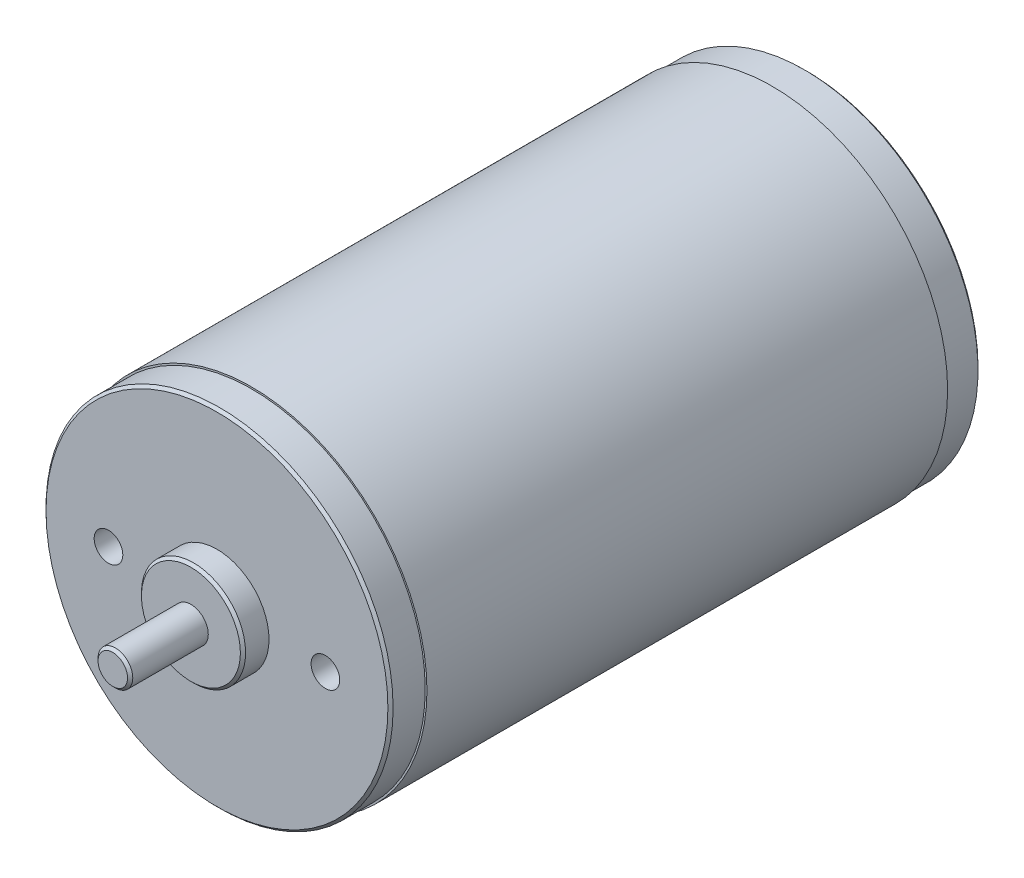
ISO-10303-21;
HEADER;
FILE_DESCRIPTION(('STEP AP214'),'2;1');
FILE_NAME('part.step','',(''),(''),'','','');
FILE_SCHEMA(('AUTOMOTIVE_DESIGN { 1 0 10303 214 1 1 1 1 }'));
ENDSEC;
DATA;
#1=APPLICATION_CONTEXT('core data for automotive mechanical design processes');
#2=APPLICATION_PROTOCOL_DEFINITION('international standard','automotive_design',2000,#1);
#3=PRODUCT_CONTEXT('',#1,'mechanical');
#4=PRODUCT('Part','Part','',(#3));
#5=PRODUCT_RELATED_PRODUCT_CATEGORY('part','',(#4));
#6=PRODUCT_DEFINITION_FORMATION('','',#4);
#7=PRODUCT_DEFINITION_CONTEXT('part definition',#1,'design');
#8=PRODUCT_DEFINITION('design','',#6,#7);
#9=PRODUCT_DEFINITION_SHAPE('','',#8);
#10=(LENGTH_UNIT() NAMED_UNIT(*) SI_UNIT(.MILLI.,.METRE.));
#11=(NAMED_UNIT(*) PLANE_ANGLE_UNIT() SI_UNIT($,.RADIAN.));
#12=(NAMED_UNIT(*) SI_UNIT($,.STERADIAN.) SOLID_ANGLE_UNIT());
#13=UNCERTAINTY_MEASURE_WITH_UNIT(LENGTH_MEASURE(1.E-05),#10,'distance_accuracy_value','');
#14=(GEOMETRIC_REPRESENTATION_CONTEXT(3) GLOBAL_UNCERTAINTY_ASSIGNED_CONTEXT((#13)) GLOBAL_UNIT_ASSIGNED_CONTEXT((#10,
#11,#12)) REPRESENTATION_CONTEXT('',''));
#15=CARTESIAN_POINT('',(0.,0.,0.));
#16=DIRECTION('',(0.,0.,1.));
#17=DIRECTION('',(1.,0.,0.));
#18=AXIS2_PLACEMENT_3D('',#15,#16,#17);
#19=CARTESIAN_POINT('',(0.,0.,-68.));
#20=DIRECTION('',(0.,0.,-1.));
#21=DIRECTION('',(-1.,0.,0.));
#22=AXIS2_PLACEMENT_3D('',#19,#20,#21);
#23=PLANE('',#22);
#24=CARTESIAN_POINT('',(0.,0.,-68.));
#25=DIRECTION('',(0.,0.,-1.));
#26=DIRECTION('',(-1.,0.,0.));
#27=AXIS2_PLACEMENT_3D('',#24,#25,#26);
#28=CIRCLE('',#27,19.7000000000306);
#29=CARTESIAN_POINT('',(-19.7000000000306,0.,-68.));
#30=VERTEX_POINT('',#29);
#31=EDGE_CURVE('E92',#30,#30,#28,.T.);
#32=ORIENTED_EDGE('',*,*,#31,.T.);
#33=EDGE_LOOP('',(#32));
#34=FACE_BOUND('',#33,.T.);
#35=CARTESIAN_POINT('',(0.,0.,-68.));
#36=DIRECTION('',(0.,0.,-1.));
#37=DIRECTION('',(-1.,0.,0.));
#38=AXIS2_PLACEMENT_3D('',#35,#36,#37);
#39=CIRCLE('',#38,6.325);
#40=CARTESIAN_POINT('',(-6.325,0.,-68.));
#41=VERTEX_POINT('',#40);
#42=EDGE_CURVE('E71',#41,#41,#39,.T.);
#43=ORIENTED_EDGE('',*,*,#42,.F.);
#44=EDGE_LOOP('',(#43));
#45=FACE_BOUND('',#44,.T.);
#46=ADVANCED_FACE('F36',(#34,#45),#23,.T.);
#47=CARTESIAN_POINT('',(20.2,0.,-64.));
#48=DIRECTION('',(0.,0.,-1.));
#49=DIRECTION('',(-1.,0.,0.));
#50=AXIS2_PLACEMENT_3D('',#47,#48,#49);
#51=PLANE('',#50);
#52=CARTESIAN_POINT('',(0.,0.,-64.));
#53=DIRECTION('',(0.,0.,1.));
#54=DIRECTION('',(1.,0.,0.));
#55=AXIS2_PLACEMENT_3D('',#52,#53,#54);
#56=CIRCLE('',#55,20.2);
#57=CARTESIAN_POINT('',(20.2,0.,-64.));
#58=VERTEX_POINT('',#57);
#59=EDGE_CURVE('E89',#58,#58,#56,.T.);
#60=ORIENTED_EDGE('',*,*,#59,.F.);
#61=EDGE_LOOP('',(#60));
#62=FACE_BOUND('',#61,.T.);
#63=CARTESIAN_POINT('',(0.,0.,-64.));
#64=DIRECTION('',(0.,0.,-1.));
#65=DIRECTION('',(-1.,0.,0.));
#66=AXIS2_PLACEMENT_3D('',#63,#64,#65);
#67=CIRCLE('',#66,20.);
#68=CARTESIAN_POINT('',(-20.,0.,-64.));
#69=VERTEX_POINT('',#68);
#70=EDGE_CURVE('E74',#69,#69,#67,.T.);
#71=ORIENTED_EDGE('',*,*,#70,.F.);
#72=EDGE_LOOP('',(#71));
#73=FACE_BOUND('',#72,.T.);
#74=ADVANCED_FACE('F131',(#62,#73),#51,.T.);
#75=CARTESIAN_POINT('',(0.,0.,3.));
#76=DIRECTION('',(0.,0.,1.));
#77=DIRECTION('',(1.,0.,0.));
#78=AXIS2_PLACEMENT_3D('',#75,#76,#77);
#79=PLANE('',#78);
#80=CARTESIAN_POINT('',(0.,0.,3.));
#81=DIRECTION('',(0.,0.,1.));
#82=DIRECTION('',(1.,0.,0.));
#83=AXIS2_PLACEMENT_3D('',#80,#81,#82);
#84=CIRCLE('',#83,5.70000000003062);
#85=CARTESIAN_POINT('',(5.70000000003062,0.,3.));
#86=VERTEX_POINT('',#85);
#87=EDGE_CURVE('E44',#86,#86,#84,.T.);
#88=ORIENTED_EDGE('',*,*,#87,.T.);
#89=EDGE_LOOP('',(#88));
#90=FACE_BOUND('',#89,.T.);
#91=CARTESIAN_POINT('',(0.,0.,3.));
#92=DIRECTION('',(0.,0.,1.));
#93=DIRECTION('',(1.,0.,0.));
#94=AXIS2_PLACEMENT_3D('',#91,#92,#93);
#95=CIRCLE('',#94,2.);
#96=CARTESIAN_POINT('',(2.,0.,3.));
#97=VERTEX_POINT('',#96);
#98=EDGE_CURVE('E77',#97,#97,#95,.T.);
#99=ORIENTED_EDGE('',*,*,#98,.F.);
#100=EDGE_LOOP('',(#99));
#101=FACE_BOUND('',#100,.T.);
#102=ADVANCED_FACE('F118',(#90,#101),#79,.T.);
#103=CARTESIAN_POINT('',(0.,0.,0.));
#104=DIRECTION('',(0.,0.,1.));
#105=DIRECTION('',(1.,0.,0.));
#106=AXIS2_PLACEMENT_3D('',#103,#104,#105);
#107=PLANE('',#106);
#108=CARTESIAN_POINT('',(0.,0.,0.));
#109=DIRECTION('',(0.,0.,1.));
#110=DIRECTION('',(1.,0.,0.));
#111=AXIS2_PLACEMENT_3D('',#108,#109,#110);
#112=CIRCLE('',#111,19.7000000000306);
#113=CARTESIAN_POINT('',(19.7000000000306,0.,0.));
#114=VERTEX_POINT('',#113);
#115=EDGE_CURVE('E104',#114,#114,#112,.T.);
#116=ORIENTED_EDGE('',*,*,#115,.T.);
#117=EDGE_LOOP('',(#116));
#118=FACE_BOUND('',#117,.T.);
#119=CARTESIAN_POINT('',(-12.5,0.,0.));
#120=DIRECTION('',(0.,0.,1.));
#121=DIRECTION('',(1.,0.,0.));
#122=AXIS2_PLACEMENT_3D('',#119,#120,#121);
#123=CIRCLE('',#122,1.64999999999999);
#124=CARTESIAN_POINT('',(-10.85,0.,0.));
#125=VERTEX_POINT('',#124);
#126=EDGE_CURVE('E61',#125,#125,#123,.T.);
#127=ORIENTED_EDGE('',*,*,#126,.F.);
#128=EDGE_LOOP('',(#127));
#129=FACE_BOUND('',#128,.T.);
#130=CARTESIAN_POINT('',(12.5,0.,0.));
#131=DIRECTION('',(0.,0.,1.));
#132=DIRECTION('',(1.,0.,0.));
#133=AXIS2_PLACEMENT_3D('',#130,#131,#132);
#134=CIRCLE('',#133,1.64999999999999);
#135=CARTESIAN_POINT('',(14.15,0.,0.));
#136=VERTEX_POINT('',#135);
#137=EDGE_CURVE('E60',#136,#136,#134,.T.);
#138=ORIENTED_EDGE('',*,*,#137,.F.);
#139=EDGE_LOOP('',(#138));
#140=FACE_BOUND('',#139,.T.);
#141=CARTESIAN_POINT('',(0.,0.,0.));
#142=DIRECTION('',(0.,0.,1.));
#143=DIRECTION('',(1.,0.,0.));
#144=AXIS2_PLACEMENT_3D('',#141,#142,#143);
#145=CIRCLE('',#144,6.);
#146=CARTESIAN_POINT('',(6.,0.,0.));
#147=VERTEX_POINT('',#146);
#148=EDGE_CURVE('E80',#147,#147,#145,.T.);
#149=ORIENTED_EDGE('',*,*,#148,.F.);
#150=EDGE_LOOP('',(#149));
#151=FACE_BOUND('',#150,.T.);
#152=ADVANCED_FACE('F159',(#118,#129,#140,#151),#107,.T.);
#153=CARTESIAN_POINT('',(0.,0.,-4.));
#154=DIRECTION('',(0.,0.,1.));
#155=DIRECTION('',(1.,0.,0.));
#156=AXIS2_PLACEMENT_3D('',#153,#154,#155);
#157=PLANE('',#156);
#158=CARTESIAN_POINT('',(0.,0.,-4.));
#159=DIRECTION('',(0.,0.,1.));
#160=DIRECTION('',(1.,0.,0.));
#161=AXIS2_PLACEMENT_3D('',#158,#159,#160);
#162=CIRCLE('',#161,20.2);
#163=CARTESIAN_POINT('',(20.2,0.,-4.));
#164=VERTEX_POINT('',#163);
#165=EDGE_CURVE('E86',#164,#164,#162,.T.);
#166=ORIENTED_EDGE('',*,*,#165,.T.);
#167=EDGE_LOOP('',(#166));
#168=FACE_BOUND('',#167,.T.);
#169=CARTESIAN_POINT('',(0.,0.,-4.));
#170=DIRECTION('',(0.,0.,1.));
#171=DIRECTION('',(1.,0.,0.));
#172=AXIS2_PLACEMENT_3D('',#169,#170,#171);
#173=CIRCLE('',#172,20.);
#174=CARTESIAN_POINT('',(20.,0.,-4.));
#175=VERTEX_POINT('',#174);
#176=EDGE_CURVE('E83',#175,#175,#173,.T.);
#177=ORIENTED_EDGE('',*,*,#176,.F.);
#178=EDGE_LOOP('',(#177));
#179=FACE_BOUND('',#178,.T.);
#180=ADVANCED_FACE('F166',(#168,#179),#157,.T.);
#181=CARTESIAN_POINT('',(0.,0.,-64.));
#182=DIRECTION('',(0.,0.,1.));
#183=DIRECTION('',(1.,0.,0.));
#184=AXIS2_PLACEMENT_3D('',#181,#182,#183);
#185=CYLINDRICAL_SURFACE('',#184,20.2);
#186=ORIENTED_EDGE('',*,*,#59,.T.);
#187=EDGE_LOOP('',(#186));
#188=FACE_BOUND('',#187,.T.);
#189=ORIENTED_EDGE('',*,*,#165,.F.);
#190=EDGE_LOOP('',(#189));
#191=FACE_BOUND('',#190,.T.);
#192=ADVANCED_FACE('F170',(#188,#191),#185,.T.);
#193=CARTESIAN_POINT('',(0.,0.,0.));
#194=DIRECTION('',(0.,0.,-1.));
#195=DIRECTION('',(-1.,0.,0.));
#196=AXIS2_PLACEMENT_3D('',#193,#194,#195);
#197=CYLINDRICAL_SURFACE('',#196,20.);
#198=CARTESIAN_POINT('',(0.,0.,-0.299999999969389));
#199=DIRECTION('',(0.,0.,1.));
#200=DIRECTION('',(1.,0.,0.));
#201=AXIS2_PLACEMENT_3D('',#198,#199,#200);
#202=CIRCLE('',#201,20.);
#203=CARTESIAN_POINT('',(20.,0.,-0.299999999969389));
#204=VERTEX_POINT('',#203);
#205=EDGE_CURVE('E107',#204,#204,#202,.F.);
#206=ORIENTED_EDGE('',*,*,#205,.T.);
#207=EDGE_LOOP('',(#206));
#208=FACE_BOUND('',#207,.T.);
#209=ORIENTED_EDGE('',*,*,#176,.T.);
#210=EDGE_LOOP('',(#209));
#211=FACE_BOUND('',#210,.T.);
#212=ADVANCED_FACE('F162',(#208,#211),#197,.T.);
#213=CARTESIAN_POINT('',(0.,0.,3.));
#214=DIRECTION('',(0.,0.,-1.));
#215=DIRECTION('',(-1.,0.,0.));
#216=AXIS2_PLACEMENT_3D('',#213,#214,#215);
#217=CYLINDRICAL_SURFACE('',#216,6.);
#218=CARTESIAN_POINT('',(0.,0.,2.70000000003062));
#219=DIRECTION('',(0.,0.,1.));
#220=DIRECTION('',(1.,0.,0.));
#221=AXIS2_PLACEMENT_3D('',#218,#219,#220);
#222=CIRCLE('',#221,6.);
#223=CARTESIAN_POINT('',(6.,0.,2.70000000003062));
#224=VERTEX_POINT('',#223);
#225=EDGE_CURVE('E11',#224,#224,#222,.F.);
#226=ORIENTED_EDGE('',*,*,#225,.T.);
#227=EDGE_LOOP('',(#226));
#228=FACE_BOUND('',#227,.T.);
#229=ORIENTED_EDGE('',*,*,#148,.T.);
#230=EDGE_LOOP('',(#229));
#231=FACE_BOUND('',#230,.T.);
#232=ADVANCED_FACE('F155',(#228,#231),#217,.T.);
#233=CARTESIAN_POINT('',(0.,0.,12.));
#234=DIRECTION('',(0.,0.,-1.));
#235=DIRECTION('',(-1.,0.,0.));
#236=AXIS2_PLACEMENT_3D('',#233,#234,#235);
#237=CYLINDRICAL_SURFACE('',#236,2.);
#238=CARTESIAN_POINT('',(0.,0.,11.7000000000306));
#239=DIRECTION('',(0.,0.,1.));
#240=DIRECTION('',(1.,0.,0.));
#241=AXIS2_PLACEMENT_3D('',#238,#239,#240);
#242=CIRCLE('',#241,2.);
#243=CARTESIAN_POINT('',(2.,0.,11.7000000000306));
#244=VERTEX_POINT('',#243);
#245=EDGE_CURVE('E101',#244,#244,#242,.F.);
#246=ORIENTED_EDGE('',*,*,#245,.T.);
#247=EDGE_LOOP('',(#246));
#248=FACE_BOUND('',#247,.T.);
#249=ORIENTED_EDGE('',*,*,#98,.T.);
#250=EDGE_LOOP('',(#249));
#251=FACE_BOUND('',#250,.T.);
#252=ADVANCED_FACE('F151',(#248,#251),#237,.T.);
#253=CARTESIAN_POINT('',(0.,0.,12.));
#254=DIRECTION('',(0.,0.,1.));
#255=DIRECTION('',(1.,0.,0.));
#256=AXIS2_PLACEMENT_3D('',#253,#254,#255);
#257=PLANE('',#256);
#258=CARTESIAN_POINT('',(0.,0.,12.));
#259=DIRECTION('',(0.,0.,1.));
#260=DIRECTION('',(1.,0.,0.));
#261=AXIS2_PLACEMENT_3D('',#258,#259,#260);
#262=CIRCLE('',#261,1.70000000003065);
#263=CARTESIAN_POINT('',(1.70000000003065,0.,12.));
#264=VERTEX_POINT('',#263);
#265=EDGE_CURVE('E98',#264,#264,#262,.T.);
#266=ORIENTED_EDGE('',*,*,#265,.T.);
#267=EDGE_LOOP('',(#266));
#268=FACE_BOUND('',#267,.T.);
#269=ADVANCED_FACE('F147',(#268),#257,.T.);
#270=CARTESIAN_POINT('',(0.,0.,-68.));
#271=DIRECTION('',(0.,0.,1.));
#272=DIRECTION('',(1.,0.,0.));
#273=AXIS2_PLACEMENT_3D('',#270,#271,#272);
#274=CYLINDRICAL_SURFACE('',#273,20.);
#275=CARTESIAN_POINT('',(0.,0.,-67.7000000000306));
#276=DIRECTION('',(0.,0.,-1.));
#277=DIRECTION('',(-1.,0.,0.));
#278=AXIS2_PLACEMENT_3D('',#275,#276,#277);
#279=CIRCLE('',#278,20.);
#280=CARTESIAN_POINT('',(-20.,0.,-67.7000000000306));
#281=VERTEX_POINT('',#280);
#282=EDGE_CURVE('E95',#281,#281,#279,.F.);
#283=ORIENTED_EDGE('',*,*,#282,.T.);
#284=EDGE_LOOP('',(#283));
#285=FACE_BOUND('',#284,.T.);
#286=ORIENTED_EDGE('',*,*,#70,.T.);
#287=EDGE_LOOP('',(#286));
#288=FACE_BOUND('',#287,.T.);
#289=ADVANCED_FACE('F144',(#285,#288),#274,.T.);
#290=CARTESIAN_POINT('',(0.,0.,-69.5));
#291=DIRECTION('',(0.,0.,1.));
#292=DIRECTION('',(1.,0.,0.));
#293=AXIS2_PLACEMENT_3D('',#290,#291,#292);
#294=CYLINDRICAL_SURFACE('',#293,6.325);
#295=CARTESIAN_POINT('',(0.,0.,-69.2000000000306));
#296=DIRECTION('',(0.,0.,-1.));
#297=DIRECTION('',(-1.,0.,0.));
#298=AXIS2_PLACEMENT_3D('',#295,#296,#297);
#299=CIRCLE('',#298,6.325);
#300=CARTESIAN_POINT('',(6.32500000000001,0.,-69.2000000000306));
#301=VERTEX_POINT('',#300);
#302=EDGE_CURVE('E113',#301,#301,#299,.F.);
#303=ORIENTED_EDGE('',*,*,#302,.T.);
#304=EDGE_LOOP('',(#303));
#305=FACE_BOUND('',#304,.T.);
#306=ORIENTED_EDGE('',*,*,#42,.T.);
#307=EDGE_LOOP('',(#306));
#308=FACE_BOUND('',#307,.T.);
#309=ADVANCED_FACE('F142',(#305,#308),#294,.T.);
#310=CARTESIAN_POINT('',(0.,0.,-69.5));
#311=DIRECTION('',(0.,0.,-1.));
#312=DIRECTION('',(-1.,0.,0.));
#313=AXIS2_PLACEMENT_3D('',#310,#311,#312);
#314=PLANE('',#313);
#315=CARTESIAN_POINT('',(0.,0.,-69.5));
#316=DIRECTION('',(0.,0.,-1.));
#317=DIRECTION('',(-1.,0.,0.));
#318=AXIS2_PLACEMENT_3D('',#315,#316,#317);
#319=CIRCLE('',#318,6.02500000003062);
#320=CARTESIAN_POINT('',(6.02500000003062,0.,-69.5));
#321=VERTEX_POINT('',#320);
#322=EDGE_CURVE('E110',#321,#321,#319,.T.);
#323=ORIENTED_EDGE('',*,*,#322,.T.);
#324=EDGE_LOOP('',(#323));
#325=FACE_BOUND('',#324,.T.);
#326=ADVANCED_FACE('F208',(#325),#314,.T.);
#327=CARTESIAN_POINT('',(12.5,0.,-8.1));
#328=DIRECTION('',(0.,0.,1.));
#329=DIRECTION('',(1.,0.,0.));
#330=AXIS2_PLACEMENT_3D('',#327,#328,#329);
#331=CONICAL_SURFACE('',#330,1.64999999999999,1.02974425849464);
#332=CARTESIAN_POINT('',(12.5,0.,-9.09142002180421));
#333=VERTEX_POINT('',#332);
#334=VERTEX_LOOP('',#333);
#335=FACE_BOUND('',#334,.T.);
#336=CARTESIAN_POINT('',(12.5,0.,-8.1));
#337=DIRECTION('',(0.,0.,1.));
#338=DIRECTION('',(1.,0.,0.));
#339=AXIS2_PLACEMENT_3D('',#336,#337,#338);
#340=CIRCLE('',#339,1.64999999999999);
#341=CARTESIAN_POINT('',(14.15,0.,-8.1));
#342=VERTEX_POINT('',#341);
#343=EDGE_CURVE('E64',#342,#342,#340,.T.);
#344=ORIENTED_EDGE('',*,*,#343,.T.);
#345=EDGE_LOOP('',(#344));
#346=FACE_BOUND('',#345,.T.);
#347=ADVANCED_FACE('F202',(#335,#346),#331,.F.);
#348=CARTESIAN_POINT('',(12.5,0.,0.));
#349=DIRECTION('',(0.,0.,1.));
#350=DIRECTION('',(1.,0.,0.));
#351=AXIS2_PLACEMENT_3D('',#348,#349,#350);
#352=CYLINDRICAL_SURFACE('',#351,1.64999999999999);
#353=ORIENTED_EDGE('',*,*,#343,.F.);
#354=EDGE_LOOP('',(#353));
#355=FACE_BOUND('',#354,.T.);
#356=ORIENTED_EDGE('',*,*,#137,.T.);
#357=EDGE_LOOP('',(#356));
#358=FACE_BOUND('',#357,.T.);
#359=ADVANCED_FACE('F54',(#355,#358),#352,.F.);
#360=CARTESIAN_POINT('',(-12.5,0.,-8.1));
#361=DIRECTION('',(0.,0.,1.));
#362=DIRECTION('',(1.,0.,0.));
#363=AXIS2_PLACEMENT_3D('',#360,#361,#362);
#364=CONICAL_SURFACE('',#363,1.64999999999999,1.02974425849464);
#365=CARTESIAN_POINT('',(-12.5,0.,-9.09142002180421));
#366=VERTEX_POINT('',#365);
#367=VERTEX_LOOP('',#366);
#368=FACE_BOUND('',#367,.T.);
#369=CARTESIAN_POINT('',(-12.5,0.,-8.1));
#370=DIRECTION('',(0.,0.,1.));
#371=DIRECTION('',(1.,0.,0.));
#372=AXIS2_PLACEMENT_3D('',#369,#370,#371);
#373=CIRCLE('',#372,1.64999999999999);
#374=CARTESIAN_POINT('',(-10.85,0.,-8.1));
#375=VERTEX_POINT('',#374);
#376=EDGE_CURVE('E58',#375,#375,#373,.T.);
#377=ORIENTED_EDGE('',*,*,#376,.T.);
#378=EDGE_LOOP('',(#377));
#379=FACE_BOUND('',#378,.T.);
#380=ADVANCED_FACE('F50',(#368,#379),#364,.F.);
#381=CARTESIAN_POINT('',(-12.5,0.,0.));
#382=DIRECTION('',(0.,0.,1.));
#383=DIRECTION('',(1.,0.,0.));
#384=AXIS2_PLACEMENT_3D('',#381,#382,#383);
#385=CYLINDRICAL_SURFACE('',#384,1.64999999999999);
#386=ORIENTED_EDGE('',*,*,#376,.F.);
#387=EDGE_LOOP('',(#386));
#388=FACE_BOUND('',#387,.T.);
#389=ORIENTED_EDGE('',*,*,#126,.T.);
#390=EDGE_LOOP('',(#389));
#391=FACE_BOUND('',#390,.T.);
#392=ADVANCED_FACE('F53',(#388,#391),#385,.F.);
#393=CARTESIAN_POINT('',(0.,0.,-68.));
#394=DIRECTION('',(0.,0.,1.));
#395=DIRECTION('',(1.,0.,0.));
#396=AXIS2_PLACEMENT_3D('',#393,#394,#395);
#397=CONICAL_SURFACE('',#396,19.7000000000306,0.785398163397466);
#398=ORIENTED_EDGE('',*,*,#282,.F.);
#399=EDGE_LOOP('',(#398));
#400=FACE_BOUND('',#399,.T.);
#401=ORIENTED_EDGE('',*,*,#31,.F.);
#402=EDGE_LOOP('',(#401));
#403=FACE_BOUND('',#402,.T.);
#404=ADVANCED_FACE('F178',(#400,#403),#397,.T.);
#405=CARTESIAN_POINT('',(0.,0.,12.));
#406=DIRECTION('',(0.,0.,-1.));
#407=DIRECTION('',(-1.,0.,0.));
#408=AXIS2_PLACEMENT_3D('',#405,#406,#407);
#409=CONICAL_SURFACE('',#408,1.70000000003065,0.785398163397431);
#410=ORIENTED_EDGE('',*,*,#245,.F.);
#411=EDGE_LOOP('',(#410));
#412=FACE_BOUND('',#411,.T.);
#413=ORIENTED_EDGE('',*,*,#265,.F.);
#414=EDGE_LOOP('',(#413));
#415=FACE_BOUND('',#414,.T.);
#416=ADVANCED_FACE('F181',(#412,#415),#409,.T.);
#417=CARTESIAN_POINT('',(0.,0.,0.));
#418=DIRECTION('',(0.,0.,-1.));
#419=DIRECTION('',(-1.,0.,0.));
#420=AXIS2_PLACEMENT_3D('',#417,#418,#419);
#421=CONICAL_SURFACE('',#420,19.7000000000306,0.785398163397454);
#422=ORIENTED_EDGE('',*,*,#205,.F.);
#423=EDGE_LOOP('',(#422));
#424=FACE_BOUND('',#423,.T.);
#425=ORIENTED_EDGE('',*,*,#115,.F.);
#426=EDGE_LOOP('',(#425));
#427=FACE_BOUND('',#426,.T.);
#428=ADVANCED_FACE('F127',(#424,#427),#421,.T.);
#429=CARTESIAN_POINT('',(0.,0.,-69.5));
#430=DIRECTION('',(0.,0.,1.));
#431=DIRECTION('',(1.,0.,0.));
#432=AXIS2_PLACEMENT_3D('',#429,#430,#431);
#433=CONICAL_SURFACE('',#432,6.02500000003062,0.785398163397431);
#434=CARTESIAN_POINT('',(6.32500000000001,0.,-69.2000000000306));
#435=CARTESIAN_POINT('',(6.32187500000032,0.,-69.2031250000303));
#436=CARTESIAN_POINT('',(6.31875000000064,0.,-69.20625000003));
#437=CARTESIAN_POINT('',(6.31250000000128,0.,-69.2125000000293));
#438=CARTESIAN_POINT('',(6.3093750000016,0.,-69.215625000029));
#439=CARTESIAN_POINT('',(6.30312500000224,0.,-69.2218750000284));
#440=CARTESIAN_POINT('',(6.30000000000256,0.,-69.2250000000281));
#441=CARTESIAN_POINT('',(6.29375000000319,0.,-69.2312500000274));
#442=CARTESIAN_POINT('',(6.29062500000351,0.,-69.2343750000271));
#443=CARTESIAN_POINT('',(6.28437500000415,0.,-69.2406250000265));
#444=CARTESIAN_POINT('',(6.28125000000447,0.,-69.2437500000261));
#445=CARTESIAN_POINT('',(6.27500000000511,0.,-69.2500000000255));
#446=CARTESIAN_POINT('',(6.27187500000543,0.,-69.2531250000252));
#447=CARTESIAN_POINT('',(6.26562500000607,0.,-69.2593750000245));
#448=CARTESIAN_POINT('',(6.26250000000638,0.,-69.2625000000242));
#449=CARTESIAN_POINT('',(6.25625000000702,0.,-69.2687500000236));
#450=CARTESIAN_POINT('',(6.25312500000734,0.,-69.2718750000233));
#451=CARTESIAN_POINT('',(6.24687500000798,0.,-69.2781250000226));
#452=CARTESIAN_POINT('',(6.2437500000083,0.,-69.2812500000223));
#453=CARTESIAN_POINT('',(6.23750000000894,0.,-69.2875000000217));
#454=CARTESIAN_POINT('',(6.23437500000925,0.,-69.2906250000214));
#455=CARTESIAN_POINT('',(6.22812500000989,0.,-69.2968750000207));
#456=CARTESIAN_POINT('',(6.22500000001021,0.,-69.3000000000204));
#457=CARTESIAN_POINT('',(6.21875000001085,0.,-69.3062500000198));
#458=CARTESIAN_POINT('',(6.21562500001117,0.,-69.3093750000194));
#459=CARTESIAN_POINT('',(6.20937500001181,0.,-69.3156250000188));
#460=CARTESIAN_POINT('',(6.20625000001213,0.,-69.3187500000185));
#461=CARTESIAN_POINT('',(6.20000000001276,0.,-69.3250000000179));
#462=CARTESIAN_POINT('',(6.19687500001308,0.,-69.3281250000175));
#463=CARTESIAN_POINT('',(6.19062500001372,0.,-69.3343750000169));
#464=CARTESIAN_POINT('',(6.18750000001404,0.,-69.3375000000166));
#465=CARTESIAN_POINT('',(6.18125000001468,0.,-69.3437500000159));
#466=CARTESIAN_POINT('',(6.178125000015,0.,-69.3468750000156));
#467=CARTESIAN_POINT('',(6.17187500001563,0.,-69.353125000015));
#468=CARTESIAN_POINT('',(6.16875000001595,0.,-69.3562500000147));
#469=CARTESIAN_POINT('',(6.16250000001659,0.,-69.362500000014));
#470=CARTESIAN_POINT('',(6.15937500001691,0.,-69.3656250000137));
#471=CARTESIAN_POINT('',(6.15312500001755,0.,-69.3718750000131));
#472=CARTESIAN_POINT('',(6.15000000001787,0.,-69.3750000000127));
#473=CARTESIAN_POINT('',(6.14375000001851,0.,-69.3812500000121));
#474=CARTESIAN_POINT('',(6.14062500001882,0.,-69.3843750000118));
#475=CARTESIAN_POINT('',(6.13437500001946,0.,-69.3906250000112));
#476=CARTESIAN_POINT('',(6.13125000001978,0.,-69.3937500000108));
#477=CARTESIAN_POINT('',(6.12500000002042,0.,-69.4000000000102));
#478=CARTESIAN_POINT('',(6.12187500002074,0.,-69.4031250000099));
#479=CARTESIAN_POINT('',(6.11562500002137,0.,-69.4093750000092));
#480=CARTESIAN_POINT('',(6.11250000002169,0.,-69.4125000000089));
#481=CARTESIAN_POINT('',(6.10625000002233,0.,-69.4187500000083));
#482=CARTESIAN_POINT('',(6.10312500002265,0.,-69.421875000008));
#483=CARTESIAN_POINT('',(6.09687500002329,0.,-69.4281250000073));
#484=CARTESIAN_POINT('',(6.09375000002361,0.,-69.431250000007));
#485=CARTESIAN_POINT('',(6.08750000002424,0.,-69.4375000000064));
#486=CARTESIAN_POINT('',(6.08437500002456,0.,-69.4406250000061));
#487=CARTESIAN_POINT('',(6.0781250000252,0.,-69.4468750000054));
#488=CARTESIAN_POINT('',(6.07500000002552,0.,-69.4500000000051));
#489=CARTESIAN_POINT('',(6.06875000002616,0.,-69.4562500000045));
#490=CARTESIAN_POINT('',(6.06562500002648,0.,-69.4593750000041));
#491=CARTESIAN_POINT('',(6.05937500002712,0.,-69.4656250000035));
#492=CARTESIAN_POINT('',(6.05625000002744,0.,-69.4687500000032));
#493=CARTESIAN_POINT('',(6.05000000002807,0.,-69.4750000000026));
#494=CARTESIAN_POINT('',(6.04687500002839,0.,-69.4781250000022));
#495=CARTESIAN_POINT('',(6.04062500002903,0.,-69.4843750000016));
#496=CARTESIAN_POINT('',(6.03750000002935,0.,-69.4875000000013));
#497=CARTESIAN_POINT('',(6.03125000002999,0.,-69.4937500000006));
#498=CARTESIAN_POINT('',(6.0281250000303,0.,-69.4968750000003));
#499=CARTESIAN_POINT('',(6.02500000003062,0.,-69.5));
#500=B_SPLINE_CURVE_WITH_KNOTS('',3,(#434,#435,#436,#437,#438,#439,#440,#441,#442,#443,#444,
#445,#446,#447,#448,#449,#450,#451,#452,#453,#454,#455,#456,#457,#458,#459,#460,#461,#462,#463,
#464,#465,#466,#467,#468,#469,#470,#471,#472,#473,#474,#475,#476,#477,#478,#479,#480,#481,#482,
#483,#484,#485,#486,#487,#488,#489,#490,#491,#492,#493,#494,#495,#496,#497,#498,#499),
.UNSPECIFIED.,.F.,.F.,(4,2,2,2,2,2,2,2,2,2,2,2,2,2,2,2,2,2,2,2,2,2,2,2,2,2,2,2,2,2,2,2,4),(0.,
0.0132582521458884,0.0265165042917867,0.0397747564376751,0.0530330085835739,0.0662912607294722,
0.0795495128753606,0.0928077650212588,0.106066017167157,0.119324269313045,0.132582521458944,
0.145840773604842,0.15909902575073,0.172357277896629,0.185615530042527,0.198873782188416,
0.212132034334314,0.225390286480212,0.238648538626101,0.251906790771999,0.265165042917898,
0.278423295063786,0.291681547209684,0.304939799355583,0.318198051501471,0.331456303647369,
0.344714555793267,0.357972807939156,0.371231060085054,0.384489312230953,0.397747564376841,
0.41100581652274,0.424264068668638),.UNSPECIFIED.);
#501=EDGE_CURVE('BSEAM122',#301,#321,#500,.T.);
#502=ORIENTED_EDGE('',*,*,#302,.F.);
#503=ORIENTED_EDGE('',*,*,#322,.F.);
#504=ORIENTED_EDGE('',*,*,#501,.T.);
#505=ORIENTED_EDGE('',*,*,#501,.F.);
#506=EDGE_LOOP('',(#502,#504,#503,#505));
#507=FACE_BOUND('',#506,.T.);
#508=ADVANCED_FACE('F122',(#507),#433,.T.);
#509=CARTESIAN_POINT('',(0.,0.,3.));
#510=DIRECTION('',(0.,0.,-1.));
#511=DIRECTION('',(-1.,0.,0.));
#512=AXIS2_PLACEMENT_3D('',#509,#510,#511);
#513=CONICAL_SURFACE('',#512,5.70000000003062,0.785398163397438);
#514=ORIENTED_EDGE('',*,*,#225,.F.);
#515=EDGE_LOOP('',(#514));
#516=FACE_BOUND('',#515,.T.);
#517=ORIENTED_EDGE('',*,*,#87,.F.);
#518=EDGE_LOOP('',(#517));
#519=FACE_BOUND('',#518,.T.);
#520=ADVANCED_FACE('F38',(#516,#519),#513,.T.);
#521=CLOSED_SHELL('',(#46,#74,#102,#152,#180,#192,#212,#232,#252,#269,#289,#309,#326,#347,#359,
#380,#392,#404,#416,#428,#508,#520));
#522=MANIFOLD_SOLID_BREP('B2',#521);
#523=ADVANCED_BREP_SHAPE_REPRESENTATION('',(#18,#522),#14);
#524=SHAPE_DEFINITION_REPRESENTATION(#9,#523);
ENDSEC;
END-ISO-10303-21;
